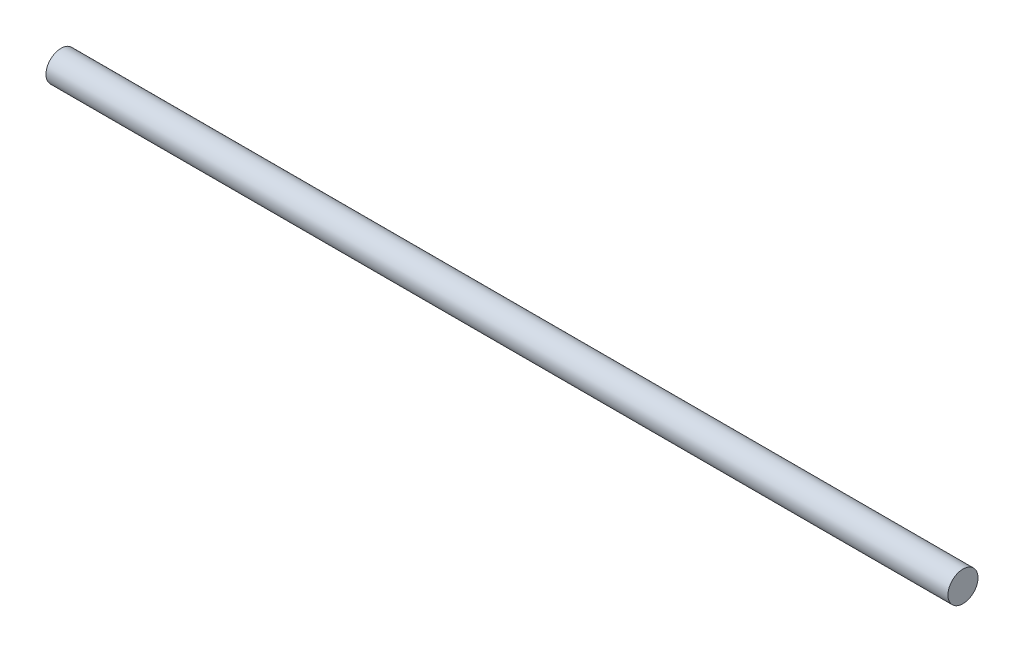
ISO-10303-21;
HEADER;
FILE_DESCRIPTION(('STEP AP214'),'2;1');
FILE_NAME('part.step','',(''),(''),'','','');
FILE_SCHEMA(('AUTOMOTIVE_DESIGN { 1 0 10303 214 1 1 1 1 }'));
ENDSEC;
DATA;
#1=APPLICATION_CONTEXT('core data for automotive mechanical design processes');
#2=APPLICATION_PROTOCOL_DEFINITION('international standard','automotive_design',2000,#1);
#3=PRODUCT_CONTEXT('',#1,'mechanical');
#4=PRODUCT('Part','Part','',(#3));
#5=PRODUCT_RELATED_PRODUCT_CATEGORY('part','',(#4));
#6=PRODUCT_DEFINITION_FORMATION('','',#4);
#7=PRODUCT_DEFINITION_CONTEXT('part definition',#1,'design');
#8=PRODUCT_DEFINITION('design','',#6,#7);
#9=PRODUCT_DEFINITION_SHAPE('','',#8);
#10=(LENGTH_UNIT() NAMED_UNIT(*) SI_UNIT(.MILLI.,.METRE.));
#11=(NAMED_UNIT(*) PLANE_ANGLE_UNIT() SI_UNIT($,.RADIAN.));
#12=(NAMED_UNIT(*) SI_UNIT($,.STERADIAN.) SOLID_ANGLE_UNIT());
#13=UNCERTAINTY_MEASURE_WITH_UNIT(LENGTH_MEASURE(1.E-05),#10,'distance_accuracy_value','');
#14=(GEOMETRIC_REPRESENTATION_CONTEXT(3) GLOBAL_UNCERTAINTY_ASSIGNED_CONTEXT((#13)) GLOBAL_UNIT_ASSIGNED_CONTEXT((#10,
#11,#12)) REPRESENTATION_CONTEXT('',''));
#15=CARTESIAN_POINT('',(0.,0.,0.));
#16=DIRECTION('',(0.,0.,1.));
#17=DIRECTION('',(1.,0.,0.));
#18=AXIS2_PLACEMENT_3D('',#15,#16,#17);
#19=CARTESIAN_POINT('',(120.,0.,0.));
#20=DIRECTION('',(-1.,0.,0.));
#21=DIRECTION('',(0.,0.,1.));
#22=AXIS2_PLACEMENT_3D('',#19,#20,#21);
#23=CYLINDRICAL_SURFACE('',#22,2.);
#24=CARTESIAN_POINT('',(120.,0.,0.));
#25=DIRECTION('',(1.,0.,0.));
#26=DIRECTION('',(0.,0.,-1.));
#27=AXIS2_PLACEMENT_3D('',#24,#25,#26);
#28=CIRCLE('',#27,2.);
#29=CARTESIAN_POINT('',(120.,0.,-2.));
#30=VERTEX_POINT('',#29);
#31=EDGE_CURVE('E10',#30,#30,#28,.T.);
#32=ORIENTED_EDGE('',*,*,#31,.F.);
#33=EDGE_LOOP('',(#32));
#34=FACE_BOUND('',#33,.T.);
#35=CARTESIAN_POINT('',(0.,0.,0.));
#36=DIRECTION('',(1.,0.,0.));
#37=DIRECTION('',(0.,0.,-1.));
#38=AXIS2_PLACEMENT_3D('',#35,#36,#37);
#39=CIRCLE('',#38,2.);
#40=CARTESIAN_POINT('',(0.,0.,-2.));
#41=VERTEX_POINT('',#40);
#42=EDGE_CURVE('E33',#41,#41,#39,.T.);
#43=ORIENTED_EDGE('',*,*,#42,.T.);
#44=EDGE_LOOP('',(#43));
#45=FACE_BOUND('',#44,.T.);
#46=ADVANCED_FACE('F30',(#34,#45),#23,.T.);
#47=CARTESIAN_POINT('',(120.,0.,0.));
#48=DIRECTION('',(1.,0.,0.));
#49=DIRECTION('',(0.,0.,-1.));
#50=AXIS2_PLACEMENT_3D('',#47,#48,#49);
#51=PLANE('',#50);
#52=ORIENTED_EDGE('',*,*,#31,.T.);
#53=EDGE_LOOP('',(#52));
#54=FACE_BOUND('',#53,.T.);
#55=ADVANCED_FACE('F45',(#54),#51,.T.);
#56=CARTESIAN_POINT('',(0.,0.,0.));
#57=DIRECTION('',(1.,0.,0.));
#58=DIRECTION('',(0.,0.,-1.));
#59=AXIS2_PLACEMENT_3D('',#56,#57,#58);
#60=PLANE('',#59);
#61=ORIENTED_EDGE('',*,*,#42,.F.);
#62=EDGE_LOOP('',(#61));
#63=FACE_BOUND('',#62,.T.);
#64=ADVANCED_FACE('F43',(#63),#60,.F.);
#65=CLOSED_SHELL('',(#46,#55,#64));
#66=MANIFOLD_SOLID_BREP('B2',#65);
#67=ADVANCED_BREP_SHAPE_REPRESENTATION('',(#18,#66),#14);
#68=SHAPE_DEFINITION_REPRESENTATION(#9,#67);
ENDSEC;
END-ISO-10303-21;
